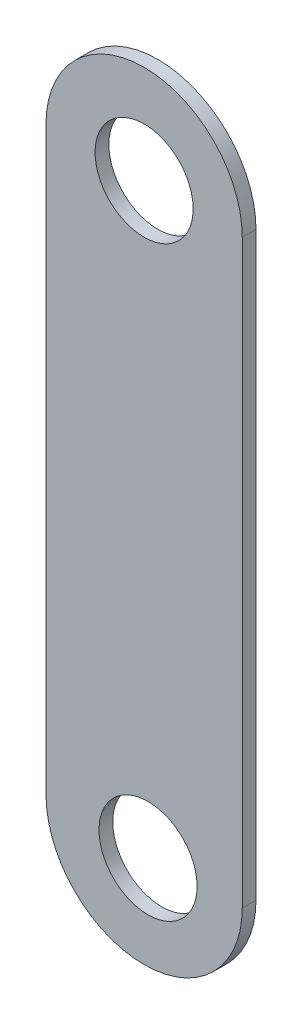
ISO-10303-21;
HEADER;
FILE_DESCRIPTION(('STEP AP214'),'2;1');
FILE_NAME('part.step','',(''),(''),'','','');
FILE_SCHEMA(('AUTOMOTIVE_DESIGN { 1 0 10303 214 1 1 1 1 }'));
ENDSEC;
DATA;
#1=APPLICATION_CONTEXT('core data for automotive mechanical design processes');
#2=APPLICATION_PROTOCOL_DEFINITION('international standard','automotive_design',2000,#1);
#3=PRODUCT_CONTEXT('',#1,'mechanical');
#4=PRODUCT('Part','Part','',(#3));
#5=PRODUCT_RELATED_PRODUCT_CATEGORY('part','',(#4));
#6=PRODUCT_DEFINITION_FORMATION('','',#4);
#7=PRODUCT_DEFINITION_CONTEXT('part definition',#1,'design');
#8=PRODUCT_DEFINITION('design','',#6,#7);
#9=PRODUCT_DEFINITION_SHAPE('','',#8);
#10=(LENGTH_UNIT() NAMED_UNIT(*) SI_UNIT(.MILLI.,.METRE.));
#11=(NAMED_UNIT(*) PLANE_ANGLE_UNIT() SI_UNIT($,.RADIAN.));
#12=(NAMED_UNIT(*) SI_UNIT($,.STERADIAN.) SOLID_ANGLE_UNIT());
#13=UNCERTAINTY_MEASURE_WITH_UNIT(LENGTH_MEASURE(1.E-05),#10,'distance_accuracy_value','');
#14=(GEOMETRIC_REPRESENTATION_CONTEXT(3) GLOBAL_UNCERTAINTY_ASSIGNED_CONTEXT((#13)) GLOBAL_UNIT_ASSIGNED_CONTEXT((#10,
#11,#12)) REPRESENTATION_CONTEXT('',''));
#15=CARTESIAN_POINT('',(0.,0.,0.));
#16=DIRECTION('',(0.,0.,1.));
#17=DIRECTION('',(1.,0.,0.));
#18=AXIS2_PLACEMENT_3D('',#15,#16,#17);
#19=CARTESIAN_POINT('',(102.3,-70.52,-0.045));
#20=DIRECTION('',(0.,0.,-1.));
#21=DIRECTION('',(0.,-1.,0.));
#22=AXIS2_PLACEMENT_3D('',#19,#20,#21);
#23=CYLINDRICAL_SURFACE('',#22,0.125);
#24=CARTESIAN_POINT('',(102.3,-70.52,-0.035));
#25=DIRECTION('',(0.,0.,-1.));
#26=DIRECTION('',(0.,-1.,0.));
#27=AXIS2_PLACEMENT_3D('',#24,#25,#26);
#28=CIRCLE('',#27,0.125);
#29=CARTESIAN_POINT('',(102.3,-70.645,-0.035));
#30=VERTEX_POINT('',#29);
#31=EDGE_CURVE('E143',#30,#30,#28,.T.);
#32=ORIENTED_EDGE('',*,*,#31,.T.);
#33=DIRECTION('',(0.,0.,1.));
#34=VECTOR('',#33,1.);
#35=CARTESIAN_POINT('',(102.3,-70.645,-0.045));
#36=LINE('',#35,#34);
#37=CARTESIAN_POINT('',(102.3,-70.645,0.));
#38=VERTEX_POINT('',#37);
#39=EDGE_CURVE('E11',#30,#38,#36,.T.);
#40=ORIENTED_EDGE('',*,*,#39,.T.);
#41=CARTESIAN_POINT('',(102.3,-70.52,0.));
#42=DIRECTION('',(0.,0.,-1.));
#43=DIRECTION('',(0.,-1.,0.));
#44=AXIS2_PLACEMENT_3D('',#41,#42,#43);
#45=CIRCLE('',#44,0.125);
#46=EDGE_CURVE('E162',#38,#38,#45,.T.);
#47=ORIENTED_EDGE('',*,*,#46,.F.);
#48=ORIENTED_EDGE('',*,*,#39,.F.);
#49=EDGE_LOOP('',(#32,#40,#47,#48));
#50=FACE_BOUND('',#49,.T.);
#51=ADVANCED_FACE('F17',(#50),#23,.F.);
#52=CARTESIAN_POINT('',(102.31,-72.01,-0.045));
#53=DIRECTION('',(0.,0.,-1.));
#54=DIRECTION('',(0.,-1.,0.));
#55=AXIS2_PLACEMENT_3D('',#52,#53,#54);
#56=CYLINDRICAL_SURFACE('',#55,0.125);
#57=CARTESIAN_POINT('',(102.31,-72.01,-0.035));
#58=DIRECTION('',(0.,0.,-1.));
#59=DIRECTION('',(0.,-1.,0.));
#60=AXIS2_PLACEMENT_3D('',#57,#58,#59);
#61=CIRCLE('',#60,0.125);
#62=CARTESIAN_POINT('',(102.31,-72.135,-0.035));
#63=VERTEX_POINT('',#62);
#64=EDGE_CURVE('E145',#63,#63,#61,.T.);
#65=ORIENTED_EDGE('',*,*,#64,.T.);
#66=DIRECTION('',(0.,0.,1.));
#67=VECTOR('',#66,1.);
#68=CARTESIAN_POINT('',(102.31,-72.135,-0.045));
#69=LINE('',#68,#67);
#70=CARTESIAN_POINT('',(102.31,-72.135,0.));
#71=VERTEX_POINT('',#70);
#72=EDGE_CURVE('E26',#63,#71,#69,.T.);
#73=ORIENTED_EDGE('',*,*,#72,.T.);
#74=CARTESIAN_POINT('',(102.31,-72.01,0.));
#75=DIRECTION('',(0.,0.,-1.));
#76=DIRECTION('',(0.,-1.,0.));
#77=AXIS2_PLACEMENT_3D('',#74,#75,#76);
#78=CIRCLE('',#77,0.125);
#79=EDGE_CURVE('E139',#71,#71,#78,.T.);
#80=ORIENTED_EDGE('',*,*,#79,.F.);
#81=ORIENTED_EDGE('',*,*,#72,.F.);
#82=EDGE_LOOP('',(#65,#73,#80,#81));
#83=FACE_BOUND('',#82,.T.);
#84=ADVANCED_FACE('F19',(#83),#56,.F.);
#85=CARTESIAN_POINT('',(102.55,-72.,-0.035));
#86=DIRECTION('',(-1.,0.,0.));
#87=DIRECTION('',(0.,0.,1.));
#88=AXIS2_PLACEMENT_3D('',#85,#86,#87);
#89=PLANE('',#88);
#90=DIRECTION('',(0.,1.,0.));
#91=VECTOR('',#90,1.);
#92=CARTESIAN_POINT('',(102.55,-72.,-0.035));
#93=LINE('',#92,#91);
#94=CARTESIAN_POINT('',(102.55,-72.,-0.035));
#95=VERTEX_POINT('',#94);
#96=CARTESIAN_POINT('',(102.55,-70.52,-0.035));
#97=VERTEX_POINT('',#96);
#98=EDGE_CURVE('E76',#95,#97,#93,.T.);
#99=ORIENTED_EDGE('',*,*,#98,.T.);
#100=DIRECTION('',(0.,0.,1.));
#101=VECTOR('',#100,1.);
#102=CARTESIAN_POINT('',(102.55,-70.52,-0.035));
#103=LINE('',#102,#101);
#104=CARTESIAN_POINT('',(102.55,-70.52,0.));
#105=VERTEX_POINT('',#104);
#106=EDGE_CURVE('E115',#97,#105,#103,.T.);
#107=ORIENTED_EDGE('',*,*,#106,.T.);
#108=DIRECTION('',(0.,1.,0.));
#109=VECTOR('',#108,1.);
#110=CARTESIAN_POINT('',(102.55,-72.,0.));
#111=LINE('',#110,#109);
#112=CARTESIAN_POINT('',(102.55,-72.,0.));
#113=VERTEX_POINT('',#112);
#114=EDGE_CURVE('E64',#113,#105,#111,.T.);
#115=ORIENTED_EDGE('',*,*,#114,.F.);
#116=DIRECTION('',(0.,0.,1.));
#117=VECTOR('',#116,1.);
#118=CARTESIAN_POINT('',(102.55,-72.,-0.035));
#119=LINE('',#118,#117);
#120=EDGE_CURVE('E153',#95,#113,#119,.T.);
#121=ORIENTED_EDGE('',*,*,#120,.F.);
#122=EDGE_LOOP('',(#99,#107,#115,#121));
#123=FACE_BOUND('',#122,.T.);
#124=ADVANCED_FACE('F227',(#123),#89,.F.);
#125=CARTESIAN_POINT('',(102.05,-70.52,0.));
#126=DIRECTION('',(0.,0.,1.));
#127=DIRECTION('',(1.,0.,0.));
#128=AXIS2_PLACEMENT_3D('',#125,#126,#127);
#129=PLANE('',#128);
#130=ORIENTED_EDGE('',*,*,#46,.T.);
#131=EDGE_LOOP('',(#130));
#132=FACE_BOUND('',#131,.T.);
#133=ORIENTED_EDGE('',*,*,#79,.T.);
#134=EDGE_LOOP('',(#133));
#135=FACE_BOUND('',#134,.T.);
#136=DIRECTION('',(0.,-1.,0.));
#137=VECTOR('',#136,1.);
#138=CARTESIAN_POINT('',(102.05,-70.52,0.));
#139=LINE('',#138,#137);
#140=CARTESIAN_POINT('',(102.05,-70.52,0.));
#141=VERTEX_POINT('',#140);
#142=CARTESIAN_POINT('',(102.05,-72.,0.));
#143=VERTEX_POINT('',#142);
#144=EDGE_CURVE('E124',#141,#143,#139,.T.);
#145=ORIENTED_EDGE('',*,*,#144,.T.);
#146=CARTESIAN_POINT('',(102.3,-72.,0.));
#147=DIRECTION('',(0.,0.,1.));
#148=DIRECTION('',(-1.,0.,0.));
#149=AXIS2_PLACEMENT_3D('',#146,#147,#148);
#150=CIRCLE('',#149,0.25);
#151=EDGE_CURVE('E100',#143,#113,#150,.T.);
#152=ORIENTED_EDGE('',*,*,#151,.T.);
#153=ORIENTED_EDGE('',*,*,#114,.T.);
#154=CARTESIAN_POINT('',(102.3,-70.52,0.));
#155=DIRECTION('',(0.,0.,1.));
#156=DIRECTION('',(1.,0.,0.));
#157=AXIS2_PLACEMENT_3D('',#154,#155,#156);
#158=CIRCLE('',#157,0.25);
#159=EDGE_CURVE('E92',#105,#141,#158,.T.);
#160=ORIENTED_EDGE('',*,*,#159,.T.);
#161=EDGE_LOOP('',(#145,#152,#153,#160));
#162=FACE_BOUND('',#161,.T.);
#163=ADVANCED_FACE('F224',(#132,#135,#162),#129,.T.);
#164=CARTESIAN_POINT('',(102.05,-70.52,-0.035));
#165=DIRECTION('',(0.,0.,1.));
#166=DIRECTION('',(1.,0.,0.));
#167=AXIS2_PLACEMENT_3D('',#164,#165,#166);
#168=PLANE('',#167);
#169=ORIENTED_EDGE('',*,*,#31,.F.);
#170=EDGE_LOOP('',(#169));
#171=FACE_BOUND('',#170,.T.);
#172=ORIENTED_EDGE('',*,*,#64,.F.);
#173=EDGE_LOOP('',(#172));
#174=FACE_BOUND('',#173,.T.);
#175=CARTESIAN_POINT('',(102.3,-70.52,-0.035));
#176=DIRECTION('',(0.,0.,1.));
#177=DIRECTION('',(1.,0.,0.));
#178=AXIS2_PLACEMENT_3D('',#175,#176,#177);
#179=CIRCLE('',#178,0.25);
#180=CARTESIAN_POINT('',(102.05,-70.52,-0.035));
#181=VERTEX_POINT('',#180);
#182=EDGE_CURVE('E110',#97,#181,#179,.T.);
#183=ORIENTED_EDGE('',*,*,#182,.F.);
#184=ORIENTED_EDGE('',*,*,#98,.F.);
#185=CARTESIAN_POINT('',(102.3,-72.,-0.035));
#186=DIRECTION('',(0.,0.,1.));
#187=DIRECTION('',(-1.,0.,0.));
#188=AXIS2_PLACEMENT_3D('',#185,#186,#187);
#189=CIRCLE('',#188,0.25);
#190=CARTESIAN_POINT('',(102.05,-72.,-0.035));
#191=VERTEX_POINT('',#190);
#192=EDGE_CURVE('E129',#191,#95,#189,.T.);
#193=ORIENTED_EDGE('',*,*,#192,.F.);
#194=DIRECTION('',(0.,-1.,0.));
#195=VECTOR('',#194,1.);
#196=CARTESIAN_POINT('',(102.05,-70.52,-0.035));
#197=LINE('',#196,#195);
#198=EDGE_CURVE('E123',#181,#191,#197,.T.);
#199=ORIENTED_EDGE('',*,*,#198,.F.);
#200=EDGE_LOOP('',(#183,#184,#193,#199));
#201=FACE_BOUND('',#200,.T.);
#202=ADVANCED_FACE('F127',(#171,#174,#201),#168,.F.);
#203=CARTESIAN_POINT('',(102.3,-72.,-0.035));
#204=DIRECTION('',(0.,0.,-1.));
#205=DIRECTION('',(-1.,0.,0.));
#206=AXIS2_PLACEMENT_3D('',#203,#204,#205);
#207=CYLINDRICAL_SURFACE('',#206,0.25);
#208=ORIENTED_EDGE('',*,*,#192,.T.);
#209=ORIENTED_EDGE('',*,*,#120,.T.);
#210=ORIENTED_EDGE('',*,*,#151,.F.);
#211=DIRECTION('',(0.,0.,1.));
#212=VECTOR('',#211,1.);
#213=CARTESIAN_POINT('',(102.05,-72.,-0.035));
#214=LINE('',#213,#212);
#215=EDGE_CURVE('E131',#191,#143,#214,.T.);
#216=ORIENTED_EDGE('',*,*,#215,.F.);
#217=EDGE_LOOP('',(#208,#209,#210,#216));
#218=FACE_BOUND('',#217,.T.);
#219=ADVANCED_FACE('F243',(#218),#207,.T.);
#220=CARTESIAN_POINT('',(102.3,-70.52,-0.035));
#221=DIRECTION('',(0.,0.,-1.));
#222=DIRECTION('',(1.,0.,0.));
#223=AXIS2_PLACEMENT_3D('',#220,#221,#222);
#224=CYLINDRICAL_SURFACE('',#223,0.25);
#225=ORIENTED_EDGE('',*,*,#182,.T.);
#226=DIRECTION('',(0.,0.,1.));
#227=VECTOR('',#226,1.);
#228=CARTESIAN_POINT('',(102.05,-70.52,-0.035));
#229=LINE('',#228,#227);
#230=EDGE_CURVE('E113',#181,#141,#229,.T.);
#231=ORIENTED_EDGE('',*,*,#230,.T.);
#232=ORIENTED_EDGE('',*,*,#159,.F.);
#233=ORIENTED_EDGE('',*,*,#106,.F.);
#234=EDGE_LOOP('',(#225,#231,#232,#233));
#235=FACE_BOUND('',#234,.T.);
#236=ADVANCED_FACE('F112',(#235),#224,.T.);
#237=CARTESIAN_POINT('',(102.05,-70.52,-0.035));
#238=DIRECTION('',(1.,0.,0.));
#239=DIRECTION('',(0.,1.,0.));
#240=AXIS2_PLACEMENT_3D('',#237,#238,#239);
#241=PLANE('',#240);
#242=ORIENTED_EDGE('',*,*,#198,.T.);
#243=ORIENTED_EDGE('',*,*,#215,.T.);
#244=ORIENTED_EDGE('',*,*,#144,.F.);
#245=ORIENTED_EDGE('',*,*,#230,.F.);
#246=EDGE_LOOP('',(#242,#243,#244,#245));
#247=FACE_BOUND('',#246,.T.);
#248=ADVANCED_FACE('F121',(#247),#241,.F.);
#249=CLOSED_SHELL('',(#51,#84,#124,#163,#202,#219,#236,#248));
#250=MANIFOLD_SOLID_BREP('B1',#249);
#251=ADVANCED_BREP_SHAPE_REPRESENTATION('',(#18,#250),#14);
#252=SHAPE_DEFINITION_REPRESENTATION(#9,#251);
ENDSEC;
END-ISO-10303-21;
